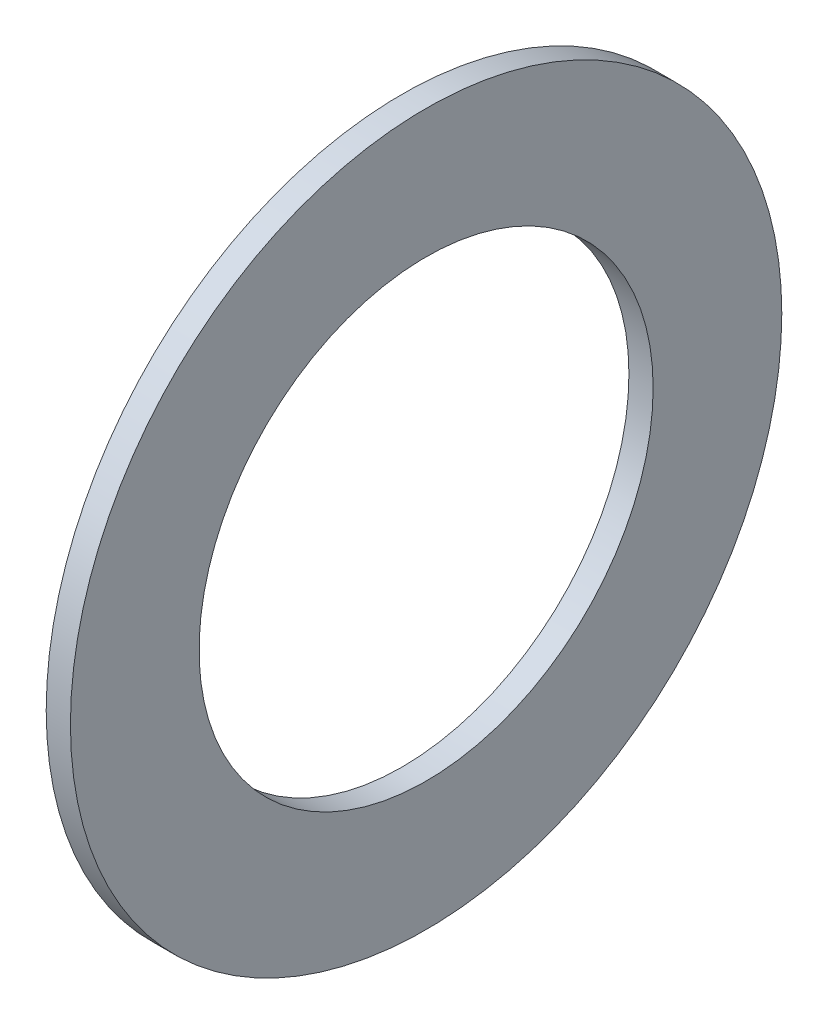
ISO-10303-21;
HEADER;
FILE_DESCRIPTION(('STEP AP214'),'2;1');
FILE_NAME('part.step','',(''),(''),'','','');
FILE_SCHEMA(('AUTOMOTIVE_DESIGN { 1 0 10303 214 1 1 1 1 }'));
ENDSEC;
DATA;
#1=APPLICATION_CONTEXT('core data for automotive mechanical design processes');
#2=APPLICATION_PROTOCOL_DEFINITION('international standard','automotive_design',2000,#1);
#3=PRODUCT_CONTEXT('',#1,'mechanical');
#4=PRODUCT('Part','Part','',(#3));
#5=PRODUCT_RELATED_PRODUCT_CATEGORY('part','',(#4));
#6=PRODUCT_DEFINITION_FORMATION('','',#4);
#7=PRODUCT_DEFINITION_CONTEXT('part definition',#1,'design');
#8=PRODUCT_DEFINITION('design','',#6,#7);
#9=PRODUCT_DEFINITION_SHAPE('','',#8);
#10=(LENGTH_UNIT() NAMED_UNIT(*) SI_UNIT(.MILLI.,.METRE.));
#11=(NAMED_UNIT(*) PLANE_ANGLE_UNIT() SI_UNIT($,.RADIAN.));
#12=(NAMED_UNIT(*) SI_UNIT($,.STERADIAN.) SOLID_ANGLE_UNIT());
#13=UNCERTAINTY_MEASURE_WITH_UNIT(LENGTH_MEASURE(1.E-05),#10,'distance_accuracy_value','');
#14=(GEOMETRIC_REPRESENTATION_CONTEXT(3) GLOBAL_UNCERTAINTY_ASSIGNED_CONTEXT((#13)) GLOBAL_UNIT_ASSIGNED_CONTEXT((#10,
#11,#12)) REPRESENTATION_CONTEXT('',''));
#15=CARTESIAN_POINT('',(0.,0.,0.));
#16=DIRECTION('',(0.,0.,1.));
#17=DIRECTION('',(1.,0.,0.));
#18=AXIS2_PLACEMENT_3D('',#15,#16,#17);
#19=CARTESIAN_POINT('',(0.8,-23.9365440779555,23.5));
#20=DIRECTION('',(1.,0.,0.));
#21=DIRECTION('',(0.,0.,-1.));
#22=AXIS2_PLACEMENT_3D('',#19,#20,#21);
#23=PLANE('',#22);
#24=CARTESIAN_POINT('',(0.8,0.,0.));
#25=DIRECTION('',(1.,0.,0.));
#26=DIRECTION('',(0.,0.,1.));
#27=AXIS2_PLACEMENT_3D('',#24,#25,#26);
#28=CIRCLE('',#27,23.5);
#29=CARTESIAN_POINT('',(0.8,0.,23.5));
#30=VERTEX_POINT('',#29);
#31=EDGE_CURVE('E30',#30,#30,#28,.T.);
#32=ORIENTED_EDGE('',*,*,#31,.T.);
#33=EDGE_LOOP('',(#32));
#34=FACE_BOUND('',#33,.T.);
#35=CARTESIAN_POINT('',(0.8,0.,0.));
#36=DIRECTION('',(-1.,0.,0.));
#37=DIRECTION('',(0.,-1.16847829190192E-09,-1.));
#38=AXIS2_PLACEMENT_3D('',#35,#36,#37);
#39=CIRCLE('',#38,15.);
#40=CARTESIAN_POINT('',(0.8,-1.75271743785288E-08,-15.));
#41=VERTEX_POINT('',#40);
#42=EDGE_CURVE('E26',#41,#41,#39,.F.);
#43=ORIENTED_EDGE('',*,*,#42,.F.);
#44=EDGE_LOOP('',(#43));
#45=FACE_BOUND('',#44,.T.);
#46=ADVANCED_FACE('F15',(#34,#45),#23,.T.);
#47=CARTESIAN_POINT('',(-0.8,-23.9365440779555,23.5));
#48=DIRECTION('',(-1.,0.,0.));
#49=DIRECTION('',(0.,1.,0.));
#50=AXIS2_PLACEMENT_3D('',#47,#48,#49);
#51=PLANE('',#50);
#52=CARTESIAN_POINT('',(-0.8,0.,0.));
#53=DIRECTION('',(-1.,0.,0.));
#54=DIRECTION('',(0.,0.,-1.));
#55=AXIS2_PLACEMENT_3D('',#52,#53,#54);
#56=CIRCLE('',#55,23.5);
#57=CARTESIAN_POINT('',(-0.8,0.,-23.5));
#58=VERTEX_POINT('',#57);
#59=EDGE_CURVE('E22',#58,#58,#56,.F.);
#60=ORIENTED_EDGE('',*,*,#59,.F.);
#61=EDGE_LOOP('',(#60));
#62=FACE_BOUND('',#61,.T.);
#63=CARTESIAN_POINT('',(-0.8,0.,0.));
#64=DIRECTION('',(1.,0.,0.));
#65=DIRECTION('',(0.,0.,1.));
#66=AXIS2_PLACEMENT_3D('',#63,#64,#65);
#67=CIRCLE('',#66,15.);
#68=CARTESIAN_POINT('',(-0.8,0.,15.));
#69=VERTEX_POINT('',#68);
#70=EDGE_CURVE('E10',#69,#69,#67,.T.);
#71=ORIENTED_EDGE('',*,*,#70,.T.);
#72=EDGE_LOOP('',(#71));
#73=FACE_BOUND('',#72,.T.);
#74=ADVANCED_FACE('F44',(#62,#73),#51,.T.);
#75=CARTESIAN_POINT('',(0.8,0.,0.));
#76=DIRECTION('',(-1.,0.,0.));
#77=DIRECTION('',(0.,1.16847876963797E-09,-1.));
#78=AXIS2_PLACEMENT_3D('',#75,#76,#77);
#79=CYLINDRICAL_SURFACE('',#78,15.);
#80=ORIENTED_EDGE('',*,*,#42,.T.);
#81=EDGE_LOOP('',(#80));
#82=FACE_BOUND('',#81,.T.);
#83=ORIENTED_EDGE('',*,*,#70,.F.);
#84=EDGE_LOOP('',(#83));
#85=FACE_BOUND('',#84,.T.);
#86=ADVANCED_FACE('F39',(#82,#85),#79,.F.);
#87=CARTESIAN_POINT('',(0.8,0.,0.));
#88=DIRECTION('',(-1.,0.,0.));
#89=DIRECTION('',(0.,0.,-1.));
#90=AXIS2_PLACEMENT_3D('',#87,#88,#89);
#91=CYLINDRICAL_SURFACE('',#90,23.5);
#92=ORIENTED_EDGE('',*,*,#31,.F.);
#93=EDGE_LOOP('',(#92));
#94=FACE_BOUND('',#93,.T.);
#95=ORIENTED_EDGE('',*,*,#59,.T.);
#96=EDGE_LOOP('',(#95));
#97=FACE_BOUND('',#96,.T.);
#98=ADVANCED_FACE('F17',(#94,#97),#91,.T.);
#99=CLOSED_SHELL('',(#46,#74,#86,#98));
#100=MANIFOLD_SOLID_BREP('B1',#99);
#101=ADVANCED_BREP_SHAPE_REPRESENTATION('',(#18,#100),#14);
#102=SHAPE_DEFINITION_REPRESENTATION(#9,#101);
ENDSEC;
END-ISO-10303-21;
